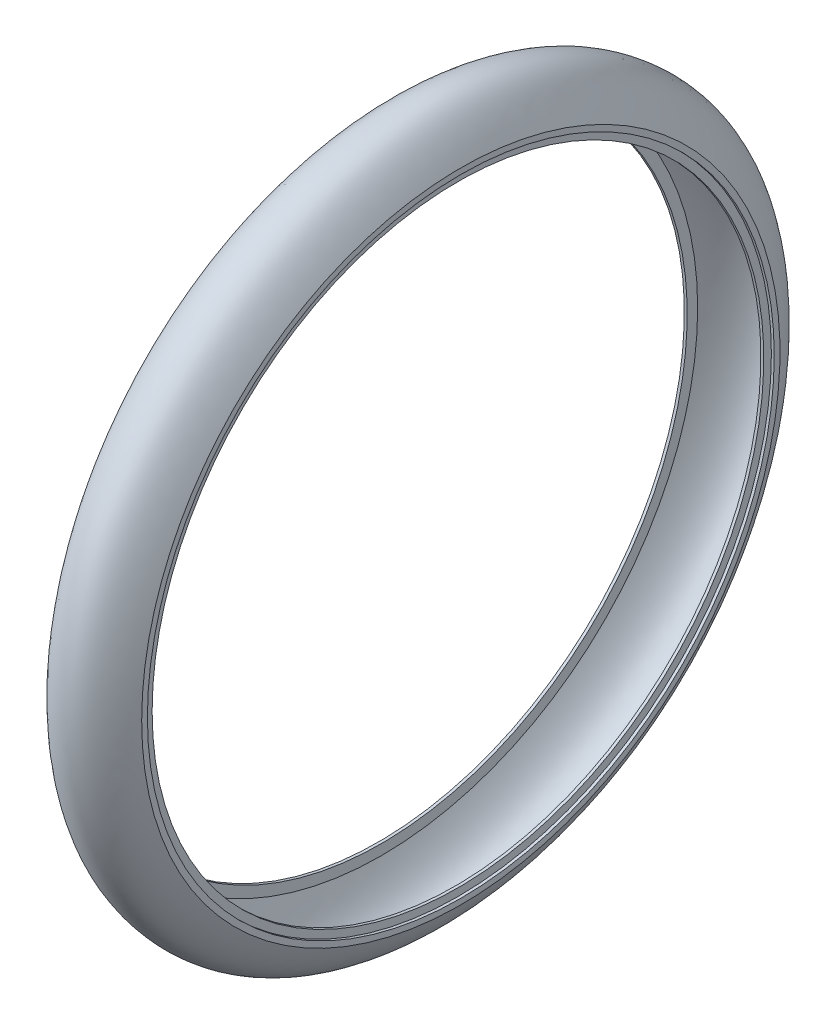
ISO-10303-21;
HEADER;
FILE_DESCRIPTION(('STEP AP214'),'2;1');
FILE_NAME('part.step','',(''),(''),'','','');
FILE_SCHEMA(('AUTOMOTIVE_DESIGN { 1 0 10303 214 1 1 1 1 }'));
ENDSEC;
DATA;
#1=APPLICATION_CONTEXT('core data for automotive mechanical design processes');
#2=APPLICATION_PROTOCOL_DEFINITION('international standard','automotive_design',2000,#1);
#3=PRODUCT_CONTEXT('',#1,'mechanical');
#4=PRODUCT('Part','Part','',(#3));
#5=PRODUCT_RELATED_PRODUCT_CATEGORY('part','',(#4));
#6=PRODUCT_DEFINITION_FORMATION('','',#4);
#7=PRODUCT_DEFINITION_CONTEXT('part definition',#1,'design');
#8=PRODUCT_DEFINITION('design','',#6,#7);
#9=PRODUCT_DEFINITION_SHAPE('','',#8);
#10=(LENGTH_UNIT() NAMED_UNIT(*) SI_UNIT(.MILLI.,.METRE.));
#11=(NAMED_UNIT(*) PLANE_ANGLE_UNIT() SI_UNIT($,.RADIAN.));
#12=(NAMED_UNIT(*) SI_UNIT($,.STERADIAN.) SOLID_ANGLE_UNIT());
#13=UNCERTAINTY_MEASURE_WITH_UNIT(LENGTH_MEASURE(1.E-05),#10,'distance_accuracy_value','');
#14=(GEOMETRIC_REPRESENTATION_CONTEXT(3) GLOBAL_UNCERTAINTY_ASSIGNED_CONTEXT((#13)) GLOBAL_UNIT_ASSIGNED_CONTEXT((#10,
#11,#12)) REPRESENTATION_CONTEXT('',''));
#15=CARTESIAN_POINT('',(0.,0.,0.));
#16=DIRECTION('',(0.,0.,1.));
#17=DIRECTION('',(1.,0.,0.));
#18=AXIS2_PLACEMENT_3D('',#15,#16,#17);
#19=CARTESIAN_POINT('',(-27.7557903868725,221.,0.));
#20=CARTESIAN_POINT('',(0.,275.,0.));
#21=CARTESIAN_POINT('',(27.7557903868725,221.,0.));
#22=B_SPLINE_CURVE_WITH_KNOTS('',2,(#19,#20,#21),.UNSPECIFIED.,.F.,.F.,(3,3),(0.,1.),.UNSPECIFIED.);
#23=CARTESIAN_POINT('',(-88.5204614269447,0.,0.));
#24=DIRECTION('',(-1.,0.,0.));
#25=AXIS1_PLACEMENT('',#23,#24);
#26=SURFACE_OF_REVOLUTION('',#22,#25);
#27=CARTESIAN_POINT('',(27.7557903868725,0.,0.));
#28=DIRECTION('',(-1.,0.,0.));
#29=DIRECTION('',(0.,0.,1.));
#30=AXIS2_PLACEMENT_3D('',#27,#28,#29);
#31=CIRCLE('',#30,221.);
#32=CARTESIAN_POINT('',(27.7557903868725,0.,221.));
#33=VERTEX_POINT('',#32);
#34=EDGE_CURVE('E10',#33,#33,#31,.T.);
#35=ORIENTED_EDGE('',*,*,#34,.F.);
#36=EDGE_LOOP('',(#35));
#37=FACE_BOUND('',#36,.T.);
#38=CARTESIAN_POINT('',(-27.7557903868725,0.,0.));
#39=DIRECTION('',(-1.,0.,0.));
#40=DIRECTION('',(0.,0.,1.));
#41=AXIS2_PLACEMENT_3D('',#38,#39,#40);
#42=CIRCLE('',#41,221.);
#43=CARTESIAN_POINT('',(-27.7557903868725,0.,221.));
#44=VERTEX_POINT('',#43);
#45=EDGE_CURVE('E82',#44,#44,#42,.T.);
#46=ORIENTED_EDGE('',*,*,#45,.T.);
#47=EDGE_LOOP('',(#46));
#48=FACE_BOUND('',#47,.T.);
#49=ADVANCED_FACE('F35',(#37,#48),#26,.T.);
#50=CARTESIAN_POINT('',(-88.5204614269447,0.,0.));
#51=DIRECTION('',(-1.,0.,0.));
#52=DIRECTION('',(0.,0.,1.));
#53=AXIS2_PLACEMENT_3D('',#50,#51,#52);
#54=CYLINDRICAL_SURFACE('',#53,221.);
#55=ORIENTED_EDGE('',*,*,#34,.T.);
#56=EDGE_LOOP('',(#55));
#57=FACE_BOUND('',#56,.T.);
#58=CARTESIAN_POINT('',(25.7557903868725,0.,0.));
#59=DIRECTION('',(-1.,0.,0.));
#60=DIRECTION('',(0.,0.,1.));
#61=AXIS2_PLACEMENT_3D('',#58,#59,#60);
#62=CIRCLE('',#61,221.);
#63=CARTESIAN_POINT('',(25.7557903868725,0.,221.));
#64=VERTEX_POINT('',#63);
#65=EDGE_CURVE('E42',#64,#64,#62,.T.);
#66=ORIENTED_EDGE('',*,*,#65,.F.);
#67=EDGE_LOOP('',(#66));
#68=FACE_BOUND('',#67,.T.);
#69=ADVANCED_FACE('F120',(#57,#68),#54,.T.);
#70=CARTESIAN_POINT('',(25.7557903868725,213.69,0.));
#71=DIRECTION('',(-1.,0.,0.));
#72=DIRECTION('',(0.,0.,1.));
#73=AXIS2_PLACEMENT_3D('',#70,#71,#72);
#74=PLANE('',#73);
#75=ORIENTED_EDGE('',*,*,#65,.T.);
#76=EDGE_LOOP('',(#75));
#77=FACE_BOUND('',#76,.T.);
#78=CARTESIAN_POINT('',(25.7557903868725,0.,0.));
#79=DIRECTION('',(-1.,0.,0.));
#80=DIRECTION('',(0.,0.,1.));
#81=AXIS2_PLACEMENT_3D('',#78,#79,#80);
#82=CIRCLE('',#81,213.69);
#83=CARTESIAN_POINT('',(25.7557903868725,0.,213.69));
#84=VERTEX_POINT('',#83);
#85=EDGE_CURVE('E46',#84,#84,#82,.T.);
#86=ORIENTED_EDGE('',*,*,#85,.F.);
#87=EDGE_LOOP('',(#86));
#88=FACE_BOUND('',#87,.T.);
#89=ADVANCED_FACE('F117',(#77,#88),#74,.T.);
#90=CARTESIAN_POINT('',(-88.5204614269447,0.,0.));
#91=DIRECTION('',(-1.,0.,0.));
#92=DIRECTION('',(0.,0.,1.));
#93=AXIS2_PLACEMENT_3D('',#90,#91,#92);
#94=CYLINDRICAL_SURFACE('',#93,213.69);
#95=CARTESIAN_POINT('',(27.7557903868725,0.,0.));
#96=DIRECTION('',(-1.,0.,0.));
#97=DIRECTION('',(0.,0.,1.));
#98=AXIS2_PLACEMENT_3D('',#95,#96,#97);
#99=CIRCLE('',#98,213.69);
#100=CARTESIAN_POINT('',(27.7557903868725,0.,213.69));
#101=VERTEX_POINT('',#100);
#102=EDGE_CURVE('E50',#101,#101,#99,.T.);
#103=ORIENTED_EDGE('',*,*,#102,.F.);
#104=EDGE_LOOP('',(#103));
#105=FACE_BOUND('',#104,.T.);
#106=ORIENTED_EDGE('',*,*,#85,.T.);
#107=EDGE_LOOP('',(#106));
#108=FACE_BOUND('',#107,.T.);
#109=ADVANCED_FACE('F113',(#105,#108),#94,.F.);
#110=CARTESIAN_POINT('',(27.7557903868725,213.69,0.));
#111=DIRECTION('',(-1.,0.,0.));
#112=DIRECTION('',(0.,0.,1.));
#113=AXIS2_PLACEMENT_3D('',#110,#111,#112);
#114=PLANE('',#113);
#115=CARTESIAN_POINT('',(27.7557903868725,0.,0.));
#116=DIRECTION('',(-1.,0.,0.));
#117=DIRECTION('',(0.,0.,1.));
#118=AXIS2_PLACEMENT_3D('',#115,#116,#117);
#119=CIRCLE('',#118,219.);
#120=CARTESIAN_POINT('',(27.7557903868725,0.,219.));
#121=VERTEX_POINT('',#120);
#122=EDGE_CURVE('E55',#121,#121,#119,.T.);
#123=ORIENTED_EDGE('',*,*,#122,.F.);
#124=EDGE_LOOP('',(#123));
#125=FACE_BOUND('',#124,.T.);
#126=ORIENTED_EDGE('',*,*,#102,.T.);
#127=EDGE_LOOP('',(#126));
#128=FACE_BOUND('',#127,.T.);
#129=ADVANCED_FACE('F109',(#125,#128),#114,.F.);
#130=CARTESIAN_POINT('',(-88.5204614269447,0.,0.));
#131=DIRECTION('',(-1.,0.,0.));
#132=DIRECTION('',(0.,0.,1.));
#133=AXIS2_PLACEMENT_3D('',#130,#131,#132);
#134=CYLINDRICAL_SURFACE('',#133,219.);
#135=CARTESIAN_POINT('',(29.7557903868725,0.,0.));
#136=DIRECTION('',(-1.,0.,0.));
#137=DIRECTION('',(0.,0.,1.));
#138=AXIS2_PLACEMENT_3D('',#135,#136,#137);
#139=CIRCLE('',#138,219.);
#140=CARTESIAN_POINT('',(29.7557903868725,0.,219.));
#141=VERTEX_POINT('',#140);
#142=EDGE_CURVE('E58',#141,#141,#139,.T.);
#143=ORIENTED_EDGE('',*,*,#142,.F.);
#144=EDGE_LOOP('',(#143));
#145=FACE_BOUND('',#144,.T.);
#146=ORIENTED_EDGE('',*,*,#122,.T.);
#147=EDGE_LOOP('',(#146));
#148=FACE_BOUND('',#147,.T.);
#149=ADVANCED_FACE('F105',(#145,#148),#134,.F.);
#150=CARTESIAN_POINT('',(29.7557903868726,219.,0.));
#151=DIRECTION('',(-1.,0.,0.));
#152=DIRECTION('',(0.,0.,1.));
#153=AXIS2_PLACEMENT_3D('',#150,#151,#152);
#154=PLANE('',#153);
#155=CARTESIAN_POINT('',(29.7557903868726,0.,0.));
#156=DIRECTION('',(-1.,0.,0.));
#157=DIRECTION('',(0.,0.,1.));
#158=AXIS2_PLACEMENT_3D('',#155,#156,#157);
#159=CIRCLE('',#158,223.);
#160=CARTESIAN_POINT('',(29.7557903868726,0.,223.));
#161=VERTEX_POINT('',#160);
#162=EDGE_CURVE('E61',#161,#161,#159,.T.);
#163=ORIENTED_EDGE('',*,*,#162,.F.);
#164=EDGE_LOOP('',(#163));
#165=FACE_BOUND('',#164,.T.);
#166=ORIENTED_EDGE('',*,*,#142,.T.);
#167=EDGE_LOOP('',(#166));
#168=FACE_BOUND('',#167,.T.);
#169=ADVANCED_FACE('F100',(#165,#168),#154,.F.);
#170=CARTESIAN_POINT('',(-29.7557903868725,223.,0.));
#171=CARTESIAN_POINT('',(-20.3764391220362,241.463411519492,0.));
#172=CARTESIAN_POINT('',(-12.3009611724455,249.216572011391,0.));
#173=CARTESIAN_POINT('',(9.15565325745631,250.708517907142,0.));
#174=CARTESIAN_POINT('',(18.655125598142,243.693763863409,0.));
#175=CARTESIAN_POINT('',(29.7557903868726,223.,0.));
#176=B_SPLINE_CURVE_WITH_KNOTS('',3,(#170,#171,#172,#173,#174,#175),.UNSPECIFIED.,.F.,.F.,(4,1,
1,4),(0.,0.504857543481088,0.604857543481088,1.),.UNSPECIFIED.);
#177=CARTESIAN_POINT('',(-88.5204614269447,0.,0.));
#178=DIRECTION('',(-1.,0.,0.));
#179=AXIS1_PLACEMENT('',#177,#178);
#180=SURFACE_OF_REVOLUTION('',#176,#179);
#181=ORIENTED_EDGE('',*,*,#162,.T.);
#182=EDGE_LOOP('',(#181));
#183=FACE_BOUND('',#182,.T.);
#184=CARTESIAN_POINT('',(-29.7557903868725,0.,0.));
#185=DIRECTION('',(-1.,0.,0.));
#186=DIRECTION('',(0.,0.,1.));
#187=AXIS2_PLACEMENT_3D('',#184,#185,#186);
#188=CIRCLE('',#187,223.);
#189=CARTESIAN_POINT('',(-29.7557903868725,0.,223.));
#190=VERTEX_POINT('',#189);
#191=EDGE_CURVE('E64',#190,#190,#188,.T.);
#192=ORIENTED_EDGE('',*,*,#191,.F.);
#193=EDGE_LOOP('',(#192));
#194=FACE_BOUND('',#193,.T.);
#195=ADVANCED_FACE('F95',(#183,#194),#180,.F.);
#196=CARTESIAN_POINT('',(-29.7557903868725,219.,0.));
#197=DIRECTION('',(-1.,0.,0.));
#198=DIRECTION('',(0.,0.,1.));
#199=AXIS2_PLACEMENT_3D('',#196,#197,#198);
#200=PLANE('',#199);
#201=ORIENTED_EDGE('',*,*,#191,.T.);
#202=EDGE_LOOP('',(#201));
#203=FACE_BOUND('',#202,.T.);
#204=CARTESIAN_POINT('',(-29.7557903868725,0.,0.));
#205=DIRECTION('',(-1.,0.,0.));
#206=DIRECTION('',(0.,0.,1.));
#207=AXIS2_PLACEMENT_3D('',#204,#205,#206);
#208=CIRCLE('',#207,219.);
#209=CARTESIAN_POINT('',(-29.7557903868725,0.,219.));
#210=VERTEX_POINT('',#209);
#211=EDGE_CURVE('E67',#210,#210,#208,.T.);
#212=ORIENTED_EDGE('',*,*,#211,.F.);
#213=EDGE_LOOP('',(#212));
#214=FACE_BOUND('',#213,.T.);
#215=ADVANCED_FACE('F99',(#203,#214),#200,.T.);
#216=CARTESIAN_POINT('',(-88.5204614269447,0.,0.));
#217=DIRECTION('',(-1.,0.,0.));
#218=DIRECTION('',(0.,0.,1.));
#219=AXIS2_PLACEMENT_3D('',#216,#217,#218);
#220=CYLINDRICAL_SURFACE('',#219,219.);
#221=ORIENTED_EDGE('',*,*,#211,.T.);
#222=EDGE_LOOP('',(#221));
#223=FACE_BOUND('',#222,.T.);
#224=CARTESIAN_POINT('',(-27.7557903868725,0.,0.));
#225=DIRECTION('',(-1.,0.,0.));
#226=DIRECTION('',(0.,0.,1.));
#227=AXIS2_PLACEMENT_3D('',#224,#225,#226);
#228=CIRCLE('',#227,219.);
#229=CARTESIAN_POINT('',(-27.7557903868725,0.,219.));
#230=VERTEX_POINT('',#229);
#231=EDGE_CURVE('E70',#230,#230,#228,.T.);
#232=ORIENTED_EDGE('',*,*,#231,.F.);
#233=EDGE_LOOP('',(#232));
#234=FACE_BOUND('',#233,.T.);
#235=ADVANCED_FACE('F152',(#223,#234),#220,.F.);
#236=CARTESIAN_POINT('',(-27.7557903868725,213.69,0.));
#237=DIRECTION('',(-1.,0.,0.));
#238=DIRECTION('',(0.,0.,1.));
#239=AXIS2_PLACEMENT_3D('',#236,#237,#238);
#240=PLANE('',#239);
#241=ORIENTED_EDGE('',*,*,#231,.T.);
#242=EDGE_LOOP('',(#241));
#243=FACE_BOUND('',#242,.T.);
#244=CARTESIAN_POINT('',(-27.7557903868725,0.,0.));
#245=DIRECTION('',(-1.,0.,0.));
#246=DIRECTION('',(0.,0.,1.));
#247=AXIS2_PLACEMENT_3D('',#244,#245,#246);
#248=CIRCLE('',#247,213.69);
#249=CARTESIAN_POINT('',(-27.7557903868725,0.,213.69));
#250=VERTEX_POINT('',#249);
#251=EDGE_CURVE('E73',#250,#250,#248,.T.);
#252=ORIENTED_EDGE('',*,*,#251,.F.);
#253=EDGE_LOOP('',(#252));
#254=FACE_BOUND('',#253,.T.);
#255=ADVANCED_FACE('F147',(#243,#254),#240,.T.);
#256=CARTESIAN_POINT('',(-88.5204614269447,0.,0.));
#257=DIRECTION('',(-1.,0.,0.));
#258=DIRECTION('',(0.,0.,1.));
#259=AXIS2_PLACEMENT_3D('',#256,#257,#258);
#260=CYLINDRICAL_SURFACE('',#259,213.69);
#261=CARTESIAN_POINT('',(-25.7557903868725,0.,0.));
#262=DIRECTION('',(-1.,0.,0.));
#263=DIRECTION('',(0.,0.,1.));
#264=AXIS2_PLACEMENT_3D('',#261,#262,#263);
#265=CIRCLE('',#264,213.69);
#266=CARTESIAN_POINT('',(-25.7557903868725,0.,213.69));
#267=VERTEX_POINT('',#266);
#268=EDGE_CURVE('E76',#267,#267,#265,.T.);
#269=ORIENTED_EDGE('',*,*,#268,.F.);
#270=EDGE_LOOP('',(#269));
#271=FACE_BOUND('',#270,.T.);
#272=ORIENTED_EDGE('',*,*,#251,.T.);
#273=EDGE_LOOP('',(#272));
#274=FACE_BOUND('',#273,.T.);
#275=ADVANCED_FACE('F141',(#271,#274),#260,.F.);
#276=CARTESIAN_POINT('',(-25.7557903868725,213.69,0.));
#277=DIRECTION('',(-1.,0.,0.));
#278=DIRECTION('',(0.,0.,1.));
#279=AXIS2_PLACEMENT_3D('',#276,#277,#278);
#280=PLANE('',#279);
#281=CARTESIAN_POINT('',(-25.7557903868725,0.,0.));
#282=DIRECTION('',(-1.,0.,0.));
#283=DIRECTION('',(0.,0.,1.));
#284=AXIS2_PLACEMENT_3D('',#281,#282,#283);
#285=CIRCLE('',#284,221.);
#286=CARTESIAN_POINT('',(-25.7557903868725,0.,221.));
#287=VERTEX_POINT('',#286);
#288=EDGE_CURVE('E79',#287,#287,#285,.T.);
#289=ORIENTED_EDGE('',*,*,#288,.F.);
#290=EDGE_LOOP('',(#289));
#291=FACE_BOUND('',#290,.T.);
#292=ORIENTED_EDGE('',*,*,#268,.T.);
#293=EDGE_LOOP('',(#292));
#294=FACE_BOUND('',#293,.T.);
#295=ADVANCED_FACE('F135',(#291,#294),#280,.F.);
#296=CARTESIAN_POINT('',(-88.5204614269447,0.,0.));
#297=DIRECTION('',(-1.,0.,0.));
#298=DIRECTION('',(0.,0.,1.));
#299=AXIS2_PLACEMENT_3D('',#296,#297,#298);
#300=CYLINDRICAL_SURFACE('',#299,221.);
#301=ORIENTED_EDGE('',*,*,#45,.F.);
#302=EDGE_LOOP('',(#301));
#303=FACE_BOUND('',#302,.T.);
#304=ORIENTED_EDGE('',*,*,#288,.T.);
#305=EDGE_LOOP('',(#304));
#306=FACE_BOUND('',#305,.T.);
#307=ADVANCED_FACE('F132',(#303,#306),#300,.T.);
#308=CLOSED_SHELL('',(#49,#69,#89,#109,#129,#149,#169,#195,#215,#235,#255,#275,#295,#307));
#309=MANIFOLD_SOLID_BREP('B2',#308);
#310=ADVANCED_BREP_SHAPE_REPRESENTATION('',(#18,#309),#14);
#311=SHAPE_DEFINITION_REPRESENTATION(#9,#310);
ENDSEC;
END-ISO-10303-21;
